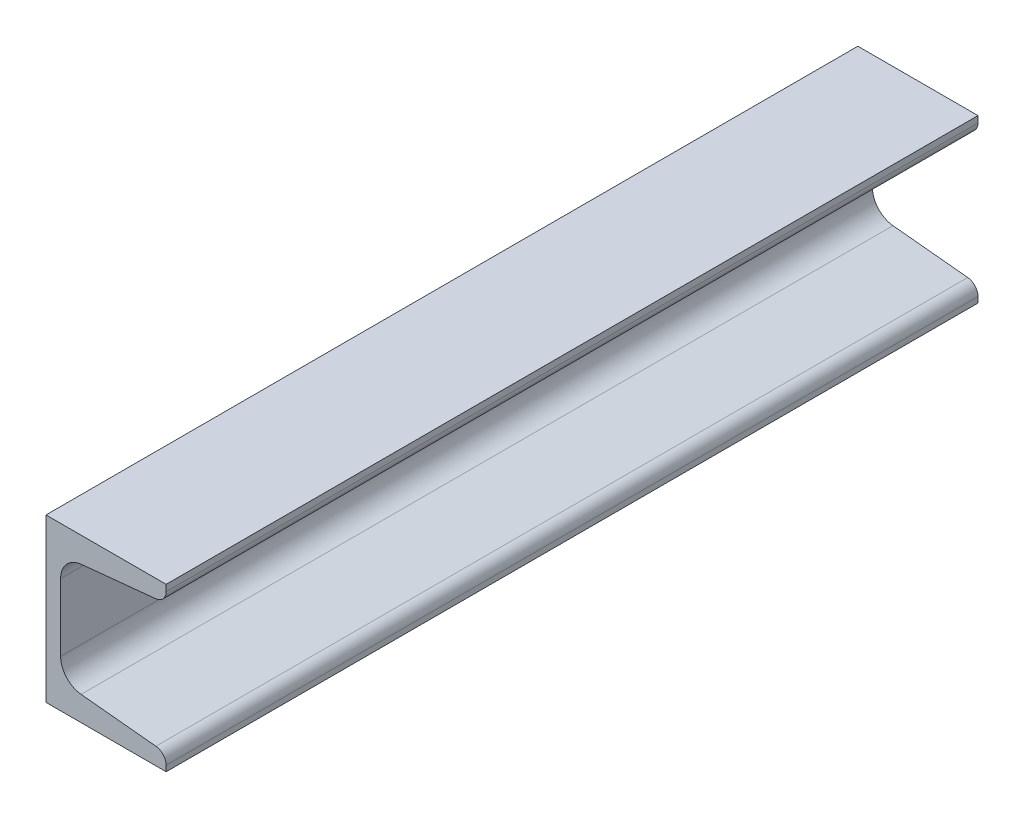
ISO-10303-21;
HEADER;
FILE_DESCRIPTION(('STEP AP214'),'2;1');
FILE_NAME('part.step','',(''),(''),'','','');
FILE_SCHEMA(('AUTOMOTIVE_DESIGN { 1 0 10303 214 1 1 1 1 }'));
ENDSEC;
DATA;
#1=APPLICATION_CONTEXT('core data for automotive mechanical design processes');
#2=APPLICATION_PROTOCOL_DEFINITION('international standard','automotive_design',2000,#1);
#3=PRODUCT_CONTEXT('',#1,'mechanical');
#4=PRODUCT('Part','Part','',(#3));
#5=PRODUCT_RELATED_PRODUCT_CATEGORY('part','',(#4));
#6=PRODUCT_DEFINITION_FORMATION('','',#4);
#7=PRODUCT_DEFINITION_CONTEXT('part definition',#1,'design');
#8=PRODUCT_DEFINITION('design','',#6,#7);
#9=PRODUCT_DEFINITION_SHAPE('','',#8);
#10=(LENGTH_UNIT() NAMED_UNIT(*) SI_UNIT(.MILLI.,.METRE.));
#11=(NAMED_UNIT(*) PLANE_ANGLE_UNIT() SI_UNIT($,.RADIAN.));
#12=(NAMED_UNIT(*) SI_UNIT($,.STERADIAN.) SOLID_ANGLE_UNIT());
#13=UNCERTAINTY_MEASURE_WITH_UNIT(LENGTH_MEASURE(1.E-05),#10,'distance_accuracy_value','');
#14=(GEOMETRIC_REPRESENTATION_CONTEXT(3) GLOBAL_UNCERTAINTY_ASSIGNED_CONTEXT((#13)) GLOBAL_UNIT_ASSIGNED_CONTEXT((#10,
#11,#12)) REPRESENTATION_CONTEXT('',''));
#15=CARTESIAN_POINT('',(0.,0.,0.));
#16=DIRECTION('',(0.,0.,1.));
#17=DIRECTION('',(1.,0.,0.));
#18=AXIS2_PLACEMENT_3D('',#15,#16,#17);
#19=CARTESIAN_POINT('',(0.,0.,250.));
#20=DIRECTION('',(0.,1.,0.));
#21=DIRECTION('',(0.,0.,1.));
#22=AXIS2_PLACEMENT_3D('',#19,#20,#21);
#23=PLANE('',#22);
#24=DIRECTION('',(1.,0.,0.));
#25=VECTOR('',#24,1.);
#26=CARTESIAN_POINT('',(0.,0.,0.));
#27=LINE('',#26,#25);
#28=CARTESIAN_POINT('',(0.,0.,0.));
#29=VERTEX_POINT('',#28);
#30=CARTESIAN_POINT('',(37.,0.,0.));
#31=VERTEX_POINT('',#30);
#32=EDGE_CURVE('E154',#29,#31,#27,.T.);
#33=ORIENTED_EDGE('',*,*,#32,.T.);
#34=DIRECTION('',(0.,0.,-1.));
#35=VECTOR('',#34,1.);
#36=CARTESIAN_POINT('',(37.,0.,250.));
#37=LINE('',#36,#35);
#38=CARTESIAN_POINT('',(37.,0.,250.));
#39=VERTEX_POINT('',#38);
#40=EDGE_CURVE('E11',#39,#31,#37,.T.);
#41=ORIENTED_EDGE('',*,*,#40,.F.);
#42=DIRECTION('',(1.,0.,0.));
#43=VECTOR('',#42,1.);
#44=CARTESIAN_POINT('',(0.,0.,250.));
#45=LINE('',#44,#43);
#46=CARTESIAN_POINT('',(0.,0.,250.));
#47=VERTEX_POINT('',#46);
#48=EDGE_CURVE('E176',#47,#39,#45,.T.);
#49=ORIENTED_EDGE('',*,*,#48,.F.);
#50=DIRECTION('',(0.,0.,-1.));
#51=VECTOR('',#50,1.);
#52=CARTESIAN_POINT('',(0.,0.,250.));
#53=LINE('',#52,#51);
#54=EDGE_CURVE('E150',#47,#29,#53,.T.);
#55=ORIENTED_EDGE('',*,*,#54,.T.);
#56=EDGE_LOOP('',(#33,#41,#49,#55));
#57=FACE_BOUND('',#56,.T.);
#58=ADVANCED_FACE('F34',(#57),#23,.F.);
#59=CARTESIAN_POINT('',(37.,0.,250.));
#60=DIRECTION('',(-1.,0.,0.));
#61=DIRECTION('',(0.,0.,1.));
#62=AXIS2_PLACEMENT_3D('',#59,#60,#61);
#63=PLANE('',#62);
#64=DIRECTION('',(0.,1.,0.));
#65=VECTOR('',#64,1.);
#66=CARTESIAN_POINT('',(37.,0.,0.));
#67=LINE('',#66,#65);
#68=CARTESIAN_POINT('',(37.,1.75754353260767,0.));
#69=VERTEX_POINT('',#68);
#70=EDGE_CURVE('E157',#31,#69,#67,.T.);
#71=ORIENTED_EDGE('',*,*,#70,.T.);
#72=DIRECTION('',(0.,0.,-1.));
#73=VECTOR('',#72,1.);
#74=CARTESIAN_POINT('',(37.,1.75754353260767,250.));
#75=LINE('',#74,#73);
#76=CARTESIAN_POINT('',(37.,1.75754353260767,250.));
#77=VERTEX_POINT('',#76);
#78=EDGE_CURVE('E42',#77,#69,#75,.T.);
#79=ORIENTED_EDGE('',*,*,#78,.F.);
#80=DIRECTION('',(0.,1.,0.));
#81=VECTOR('',#80,1.);
#82=CARTESIAN_POINT('',(37.,0.,250.));
#83=LINE('',#82,#81);
#84=EDGE_CURVE('E105',#39,#77,#83,.T.);
#85=ORIENTED_EDGE('',*,*,#84,.F.);
#86=ORIENTED_EDGE('',*,*,#40,.T.);
#87=EDGE_LOOP('',(#71,#79,#85,#86));
#88=FACE_BOUND('',#87,.T.);
#89=ADVANCED_FACE('F254',(#88),#63,.F.);
#90=CARTESIAN_POINT('',(33.5,1.75754353260769,250.));
#91=DIRECTION('',(0.,0.,-1.));
#92=DIRECTION('',(-1.,0.,0.));
#93=AXIS2_PLACEMENT_3D('',#90,#91,#92);
#94=CYLINDRICAL_SURFACE('',#93,3.5);
#95=CARTESIAN_POINT('',(33.5,1.75754353260769,0.));
#96=DIRECTION('',(0.,0.,1.));
#97=DIRECTION('',(1.,0.,0.));
#98=AXIS2_PLACEMENT_3D('',#95,#96,#97);
#99=CIRCLE('',#98,3.5);
#100=CARTESIAN_POINT('',(33.8482630165735,5.24017369834266,0.));
#101=VERTEX_POINT('',#100);
#102=EDGE_CURVE('E159',#69,#101,#99,.T.);
#103=ORIENTED_EDGE('',*,*,#102,.T.);
#104=DIRECTION('',(0.,0.,-1.));
#105=VECTOR('',#104,1.);
#106=CARTESIAN_POINT('',(33.8482630165735,5.24017369834266,250.));
#107=LINE('',#106,#105);
#108=CARTESIAN_POINT('',(33.8482630165735,5.24017369834266,250.));
#109=VERTEX_POINT('',#108);
#110=EDGE_CURVE('E195',#109,#101,#107,.T.);
#111=ORIENTED_EDGE('',*,*,#110,.F.);
#112=CARTESIAN_POINT('',(33.5,1.75754353260769,250.));
#113=DIRECTION('',(0.,0.,1.));
#114=DIRECTION('',(1.,0.,0.));
#115=AXIS2_PLACEMENT_3D('',#112,#113,#114);
#116=CIRCLE('',#115,3.5);
#117=EDGE_CURVE('E203',#77,#109,#116,.T.);
#118=ORIENTED_EDGE('',*,*,#117,.F.);
#119=ORIENTED_EDGE('',*,*,#78,.T.);
#120=EDGE_LOOP('',(#103,#111,#118,#119));
#121=FACE_BOUND('',#120,.T.);
#122=ADVANCED_FACE('F201',(#121),#94,.T.);
#123=CARTESIAN_POINT('',(10.8034739668531,7.5446526033147,250.));
#124=DIRECTION('',(-0.0995037190209989,-0.995037190209989,0.));
#125=DIRECTION('',(0.995037190209989,-0.0995037190209989,0.));
#126=AXIS2_PLACEMENT_3D('',#123,#124,#125);
#127=PLANE('',#126);
#128=DIRECTION('',(-0.995037190209989,0.0995037190209989,0.));
#129=VECTOR('',#128,1.);
#130=CARTESIAN_POINT('',(10.8034739668531,7.5446526033147,0.));
#131=LINE('',#130,#129);
#132=CARTESIAN_POINT('',(10.8034739668531,7.5446526033147,0.));
#133=VERTEX_POINT('',#132);
#134=EDGE_CURVE('E161',#101,#133,#131,.T.);
#135=ORIENTED_EDGE('',*,*,#134,.T.);
#136=DIRECTION('',(0.,0.,-1.));
#137=VECTOR('',#136,1.);
#138=CARTESIAN_POINT('',(10.8034739668531,7.5446526033147,250.));
#139=LINE('',#138,#137);
#140=CARTESIAN_POINT('',(10.8034739668531,7.5446526033147,250.));
#141=VERTEX_POINT('',#140);
#142=EDGE_CURVE('E192',#141,#133,#139,.T.);
#143=ORIENTED_EDGE('',*,*,#142,.F.);
#144=DIRECTION('',(-0.995037190209989,0.0995037190209989,0.));
#145=VECTOR('',#144,1.);
#146=CARTESIAN_POINT('',(10.8034739668531,7.5446526033147,250.));
#147=LINE('',#146,#145);
#148=EDGE_CURVE('E221',#109,#141,#147,.T.);
#149=ORIENTED_EDGE('',*,*,#148,.F.);
#150=ORIENTED_EDGE('',*,*,#110,.T.);
#151=EDGE_LOOP('',(#135,#143,#149,#150));
#152=FACE_BOUND('',#151,.T.);
#153=ADVANCED_FACE('F212',(#152),#127,.F.);
#154=CARTESIAN_POINT('',(11.5,14.5099129347846,250.));
#155=DIRECTION('',(0.,0.,-1.));
#156=DIRECTION('',(-1.,0.,0.));
#157=AXIS2_PLACEMENT_3D('',#154,#155,#156);
#158=CYLINDRICAL_SURFACE('',#157,7.);
#159=CARTESIAN_POINT('',(11.5,14.5099129347846,0.));
#160=DIRECTION('',(0.,0.,-1.));
#161=DIRECTION('',(1.,0.,0.));
#162=AXIS2_PLACEMENT_3D('',#159,#160,#161);
#163=CIRCLE('',#162,7.);
#164=CARTESIAN_POINT('',(4.5,14.5099129347847,0.));
#165=VERTEX_POINT('',#164);
#166=EDGE_CURVE('E163',#133,#165,#163,.T.);
#167=ORIENTED_EDGE('',*,*,#166,.T.);
#168=DIRECTION('',(0.,0.,-1.));
#169=VECTOR('',#168,1.);
#170=CARTESIAN_POINT('',(4.5,14.5099129347847,250.));
#171=LINE('',#170,#169);
#172=CARTESIAN_POINT('',(4.5,14.5099129347847,250.));
#173=VERTEX_POINT('',#172);
#174=EDGE_CURVE('E189',#173,#165,#171,.T.);
#175=ORIENTED_EDGE('',*,*,#174,.F.);
#176=CARTESIAN_POINT('',(11.5,14.5099129347846,250.));
#177=DIRECTION('',(0.,0.,-1.));
#178=DIRECTION('',(1.,0.,0.));
#179=AXIS2_PLACEMENT_3D('',#176,#177,#178);
#180=CIRCLE('',#179,7.);
#181=EDGE_CURVE('E218',#141,#173,#180,.T.);
#182=ORIENTED_EDGE('',*,*,#181,.F.);
#183=ORIENTED_EDGE('',*,*,#142,.T.);
#184=EDGE_LOOP('',(#167,#175,#182,#183));
#185=FACE_BOUND('',#184,.T.);
#186=ADVANCED_FACE('F216',(#185),#158,.F.);
#187=CARTESIAN_POINT('',(4.5,14.5099129347847,250.));
#188=DIRECTION('',(-1.,0.,0.));
#189=DIRECTION('',(0.,-1.,0.));
#190=AXIS2_PLACEMENT_3D('',#187,#188,#189);
#191=PLANE('',#190);
#192=DIRECTION('',(0.,1.,0.));
#193=VECTOR('',#192,1.);
#194=CARTESIAN_POINT('',(4.5,14.5099129347847,0.));
#195=LINE('',#194,#193);
#196=CARTESIAN_POINT('',(4.5,35.2876429963102,0.));
#197=VERTEX_POINT('',#196);
#198=EDGE_CURVE('E165',#165,#197,#195,.T.);
#199=ORIENTED_EDGE('',*,*,#198,.T.);
#200=DIRECTION('',(0.,0.,-1.));
#201=VECTOR('',#200,1.);
#202=CARTESIAN_POINT('',(4.5,35.2876429963102,250.));
#203=LINE('',#202,#201);
#204=CARTESIAN_POINT('',(4.5,35.2876429963102,250.));
#205=VERTEX_POINT('',#204);
#206=EDGE_CURVE('E186',#205,#197,#203,.T.);
#207=ORIENTED_EDGE('',*,*,#206,.F.);
#208=DIRECTION('',(0.,1.,0.));
#209=VECTOR('',#208,1.);
#210=CARTESIAN_POINT('',(4.5,14.5099129347847,250.));
#211=LINE('',#210,#209);
#212=EDGE_CURVE('E220',#173,#205,#211,.T.);
#213=ORIENTED_EDGE('',*,*,#212,.F.);
#214=ORIENTED_EDGE('',*,*,#174,.T.);
#215=EDGE_LOOP('',(#199,#207,#213,#214));
#216=FACE_BOUND('',#215,.T.);
#217=ADVANCED_FACE('F267',(#216),#191,.F.);
#218=CARTESIAN_POINT('',(11.5,35.2876429963103,250.));
#219=DIRECTION('',(0.,0.,-1.));
#220=DIRECTION('',(-1.,0.,0.));
#221=AXIS2_PLACEMENT_3D('',#218,#219,#220);
#222=CYLINDRICAL_SURFACE('',#221,7.);
#223=CARTESIAN_POINT('',(11.5,35.2876429963103,0.));
#224=DIRECTION('',(0.,0.,-1.));
#225=DIRECTION('',(1.,0.,0.));
#226=AXIS2_PLACEMENT_3D('',#223,#224,#225);
#227=CIRCLE('',#226,7.);
#228=CARTESIAN_POINT('',(10.803473966853,42.2529033277802,0.));
#229=VERTEX_POINT('',#228);
#230=EDGE_CURVE('E167',#197,#229,#227,.T.);
#231=ORIENTED_EDGE('',*,*,#230,.T.);
#232=DIRECTION('',(0.,0.,-1.));
#233=VECTOR('',#232,1.);
#234=CARTESIAN_POINT('',(10.803473966853,42.2529033277802,250.));
#235=LINE('',#234,#233);
#236=CARTESIAN_POINT('',(10.803473966853,42.2529033277802,250.));
#237=VERTEX_POINT('',#236);
#238=EDGE_CURVE('E183',#237,#229,#235,.T.);
#239=ORIENTED_EDGE('',*,*,#238,.F.);
#240=CARTESIAN_POINT('',(11.5,35.2876429963103,250.));
#241=DIRECTION('',(0.,0.,-1.));
#242=DIRECTION('',(1.,0.,0.));
#243=AXIS2_PLACEMENT_3D('',#240,#241,#242);
#244=CIRCLE('',#243,7.);
#245=EDGE_CURVE('E223',#205,#237,#244,.T.);
#246=ORIENTED_EDGE('',*,*,#245,.F.);
#247=ORIENTED_EDGE('',*,*,#206,.T.);
#248=EDGE_LOOP('',(#231,#239,#246,#247));
#249=FACE_BOUND('',#248,.T.);
#250=ADVANCED_FACE('F270',(#249),#222,.F.);
#251=CARTESIAN_POINT('',(10.803473966853,42.2529033277802,250.));
#252=DIRECTION('',(-0.0995037190209989,0.995037190209989,0.));
#253=DIRECTION('',(-0.995037190209989,-0.0995037190209989,0.));
#254=AXIS2_PLACEMENT_3D('',#251,#252,#253);
#255=PLANE('',#254);
#256=DIRECTION('',(0.995037190209989,0.0995037190209989,0.));
#257=VECTOR('',#256,1.);
#258=CARTESIAN_POINT('',(10.803473966853,42.2529033277802,0.));
#259=LINE('',#258,#257);
#260=CARTESIAN_POINT('',(33.8482630165735,44.5573822327522,0.));
#261=VERTEX_POINT('',#260);
#262=EDGE_CURVE('E169',#229,#261,#259,.T.);
#263=ORIENTED_EDGE('',*,*,#262,.T.);
#264=DIRECTION('',(0.,0.,-1.));
#265=VECTOR('',#264,1.);
#266=CARTESIAN_POINT('',(33.8482630165735,44.5573822327522,250.));
#267=LINE('',#266,#265);
#268=CARTESIAN_POINT('',(33.8482630165735,44.5573822327522,250.));
#269=VERTEX_POINT('',#268);
#270=EDGE_CURVE('E180',#269,#261,#267,.T.);
#271=ORIENTED_EDGE('',*,*,#270,.F.);
#272=DIRECTION('',(0.995037190209989,0.0995037190209989,0.));
#273=VECTOR('',#272,1.);
#274=CARTESIAN_POINT('',(10.803473966853,42.2529033277802,250.));
#275=LINE('',#274,#273);
#276=EDGE_CURVE('E229',#237,#269,#275,.T.);
#277=ORIENTED_EDGE('',*,*,#276,.F.);
#278=ORIENTED_EDGE('',*,*,#238,.T.);
#279=EDGE_LOOP('',(#263,#271,#277,#278));
#280=FACE_BOUND('',#279,.T.);
#281=ADVANCED_FACE('F235',(#280),#255,.F.);
#282=CARTESIAN_POINT('',(33.5,48.0400123984872,250.));
#283=DIRECTION('',(0.,0.,-1.));
#284=DIRECTION('',(-1.,0.,0.));
#285=AXIS2_PLACEMENT_3D('',#282,#283,#284);
#286=CYLINDRICAL_SURFACE('',#285,3.50000000000001);
#287=CARTESIAN_POINT('',(33.5,48.0400123984872,0.));
#288=DIRECTION('',(0.,0.,1.));
#289=DIRECTION('',(1.,0.,0.));
#290=AXIS2_PLACEMENT_3D('',#287,#288,#289);
#291=CIRCLE('',#290,3.50000000000001);
#292=CARTESIAN_POINT('',(37.,48.0400123984872,0.));
#293=VERTEX_POINT('',#292);
#294=EDGE_CURVE('E171',#261,#293,#291,.T.);
#295=ORIENTED_EDGE('',*,*,#294,.T.);
#296=DIRECTION('',(0.,0.,-1.));
#297=VECTOR('',#296,1.);
#298=CARTESIAN_POINT('',(37.,48.0400123984872,250.));
#299=LINE('',#298,#297);
#300=CARTESIAN_POINT('',(37.,48.0400123984872,250.));
#301=VERTEX_POINT('',#300);
#302=EDGE_CURVE('E145',#301,#293,#299,.T.);
#303=ORIENTED_EDGE('',*,*,#302,.F.);
#304=CARTESIAN_POINT('',(33.5,48.0400123984872,250.));
#305=DIRECTION('',(0.,0.,1.));
#306=DIRECTION('',(1.,0.,0.));
#307=AXIS2_PLACEMENT_3D('',#304,#305,#306);
#308=CIRCLE('',#307,3.50000000000001);
#309=EDGE_CURVE('E136',#269,#301,#308,.T.);
#310=ORIENTED_EDGE('',*,*,#309,.F.);
#311=ORIENTED_EDGE('',*,*,#270,.T.);
#312=EDGE_LOOP('',(#295,#303,#310,#311));
#313=FACE_BOUND('',#312,.T.);
#314=ADVANCED_FACE('F239',(#313),#286,.T.);
#315=CARTESIAN_POINT('',(37.,48.0400123984872,250.));
#316=DIRECTION('',(-1.,0.,0.));
#317=DIRECTION('',(0.,0.,1.));
#318=AXIS2_PLACEMENT_3D('',#315,#316,#317);
#319=PLANE('',#318);
#320=DIRECTION('',(0.,1.,0.));
#321=VECTOR('',#320,1.);
#322=CARTESIAN_POINT('',(37.,48.0400123984872,0.));
#323=LINE('',#322,#321);
#324=CARTESIAN_POINT('',(37.,50.,0.));
#325=VERTEX_POINT('',#324);
#326=EDGE_CURVE('E144',#293,#325,#323,.T.);
#327=ORIENTED_EDGE('',*,*,#326,.T.);
#328=DIRECTION('',(0.,0.,-1.));
#329=VECTOR('',#328,1.);
#330=CARTESIAN_POINT('',(37.,50.,250.));
#331=LINE('',#330,#329);
#332=CARTESIAN_POINT('',(37.,50.,250.));
#333=VERTEX_POINT('',#332);
#334=EDGE_CURVE('E141',#333,#325,#331,.T.);
#335=ORIENTED_EDGE('',*,*,#334,.F.);
#336=DIRECTION('',(0.,1.,0.));
#337=VECTOR('',#336,1.);
#338=CARTESIAN_POINT('',(37.,48.0400123984872,250.));
#339=LINE('',#338,#337);
#340=EDGE_CURVE('E130',#301,#333,#339,.T.);
#341=ORIENTED_EDGE('',*,*,#340,.F.);
#342=ORIENTED_EDGE('',*,*,#302,.T.);
#343=EDGE_LOOP('',(#327,#335,#341,#342));
#344=FACE_BOUND('',#343,.T.);
#345=ADVANCED_FACE('F142',(#344),#319,.F.);
#346=CARTESIAN_POINT('',(-1.71512449944288E-13,50.,250.));
#347=DIRECTION('',(0.,-1.,0.));
#348=DIRECTION('',(0.,0.,-1.));
#349=AXIS2_PLACEMENT_3D('',#346,#347,#348);
#350=PLANE('',#349);
#351=DIRECTION('',(-1.,0.,0.));
#352=VECTOR('',#351,1.);
#353=CARTESIAN_POINT('',(-1.71512449944288E-13,50.,0.));
#354=LINE('',#353,#352);
#355=CARTESIAN_POINT('',(-1.71512449944288E-13,50.,0.));
#356=VERTEX_POINT('',#355);
#357=EDGE_CURVE('E91',#325,#356,#354,.T.);
#358=ORIENTED_EDGE('',*,*,#357,.T.);
#359=DIRECTION('',(0.,0.,-1.));
#360=VECTOR('',#359,1.);
#361=CARTESIAN_POINT('',(-1.71512449944288E-13,50.,250.));
#362=LINE('',#361,#360);
#363=CARTESIAN_POINT('',(-1.71512449944288E-13,50.,250.));
#364=VERTEX_POINT('',#363);
#365=EDGE_CURVE('E146',#364,#356,#362,.T.);
#366=ORIENTED_EDGE('',*,*,#365,.F.);
#367=DIRECTION('',(-1.,0.,0.));
#368=VECTOR('',#367,1.);
#369=CARTESIAN_POINT('',(-1.71512449944288E-13,50.,250.));
#370=LINE('',#369,#368);
#371=EDGE_CURVE('E134',#333,#364,#370,.T.);
#372=ORIENTED_EDGE('',*,*,#371,.F.);
#373=ORIENTED_EDGE('',*,*,#334,.T.);
#374=EDGE_LOOP('',(#358,#366,#372,#373));
#375=FACE_BOUND('',#374,.T.);
#376=ADVANCED_FACE('F148',(#375),#350,.F.);
#377=CARTESIAN_POINT('',(0.,0.,250.));
#378=DIRECTION('',(1.,0.,0.));
#379=DIRECTION('',(0.,1.,0.));
#380=AXIS2_PLACEMENT_3D('',#377,#378,#379);
#381=PLANE('',#380);
#382=DIRECTION('',(0.,-1.,0.));
#383=VECTOR('',#382,1.);
#384=CARTESIAN_POINT('',(0.,0.,0.));
#385=LINE('',#384,#383);
#386=EDGE_CURVE('E97',#356,#29,#385,.T.);
#387=ORIENTED_EDGE('',*,*,#386,.T.);
#388=ORIENTED_EDGE('',*,*,#54,.F.);
#389=DIRECTION('',(0.,-1.,0.));
#390=VECTOR('',#389,1.);
#391=CARTESIAN_POINT('',(0.,0.,250.));
#392=LINE('',#391,#390);
#393=EDGE_CURVE('E50',#364,#47,#392,.T.);
#394=ORIENTED_EDGE('',*,*,#393,.F.);
#395=ORIENTED_EDGE('',*,*,#365,.T.);
#396=EDGE_LOOP('',(#387,#388,#394,#395));
#397=FACE_BOUND('',#396,.T.);
#398=ADVANCED_FACE('F243',(#397),#381,.F.);
#399=CARTESIAN_POINT('',(33.5,1.75754353260769,250.));
#400=DIRECTION('',(0.,0.,1.));
#401=DIRECTION('',(1.,0.,0.));
#402=AXIS2_PLACEMENT_3D('',#399,#400,#401);
#403=PLANE('',#402);
#404=ORIENTED_EDGE('',*,*,#48,.T.);
#405=ORIENTED_EDGE('',*,*,#84,.T.);
#406=ORIENTED_EDGE('',*,*,#117,.T.);
#407=ORIENTED_EDGE('',*,*,#148,.T.);
#408=ORIENTED_EDGE('',*,*,#181,.T.);
#409=ORIENTED_EDGE('',*,*,#212,.T.);
#410=ORIENTED_EDGE('',*,*,#245,.T.);
#411=ORIENTED_EDGE('',*,*,#276,.T.);
#412=ORIENTED_EDGE('',*,*,#309,.T.);
#413=ORIENTED_EDGE('',*,*,#340,.T.);
#414=ORIENTED_EDGE('',*,*,#371,.T.);
#415=ORIENTED_EDGE('',*,*,#393,.T.);
#416=EDGE_LOOP('',(#404,#405,#406,#407,#408,#409,#410,#411,#412,#413,#414,#415));
#417=FACE_BOUND('',#416,.T.);
#418=ADVANCED_FACE('F132',(#417),#403,.T.);
#419=CARTESIAN_POINT('',(33.5,1.75754353260769,0.));
#420=DIRECTION('',(0.,0.,1.));
#421=DIRECTION('',(1.,0.,0.));
#422=AXIS2_PLACEMENT_3D('',#419,#420,#421);
#423=PLANE('',#422);
#424=ORIENTED_EDGE('',*,*,#32,.F.);
#425=ORIENTED_EDGE('',*,*,#386,.F.);
#426=ORIENTED_EDGE('',*,*,#357,.F.);
#427=ORIENTED_EDGE('',*,*,#326,.F.);
#428=ORIENTED_EDGE('',*,*,#294,.F.);
#429=ORIENTED_EDGE('',*,*,#262,.F.);
#430=ORIENTED_EDGE('',*,*,#230,.F.);
#431=ORIENTED_EDGE('',*,*,#198,.F.);
#432=ORIENTED_EDGE('',*,*,#166,.F.);
#433=ORIENTED_EDGE('',*,*,#134,.F.);
#434=ORIENTED_EDGE('',*,*,#102,.F.);
#435=ORIENTED_EDGE('',*,*,#70,.F.);
#436=EDGE_LOOP('',(#424,#425,#426,#427,#428,#429,#430,#431,#432,#433,#434,#435));
#437=FACE_BOUND('',#436,.T.);
#438=ADVANCED_FACE('F207',(#437),#423,.F.);
#439=CLOSED_SHELL('',(#58,#89,#122,#153,#186,#217,#250,#281,#314,#345,#376,#398,#418,#438));
#440=MANIFOLD_SOLID_BREP('B2',#439);
#441=ADVANCED_BREP_SHAPE_REPRESENTATION('',(#18,#440),#14);
#442=SHAPE_DEFINITION_REPRESENTATION(#9,#441);
ENDSEC;
END-ISO-10303-21;
